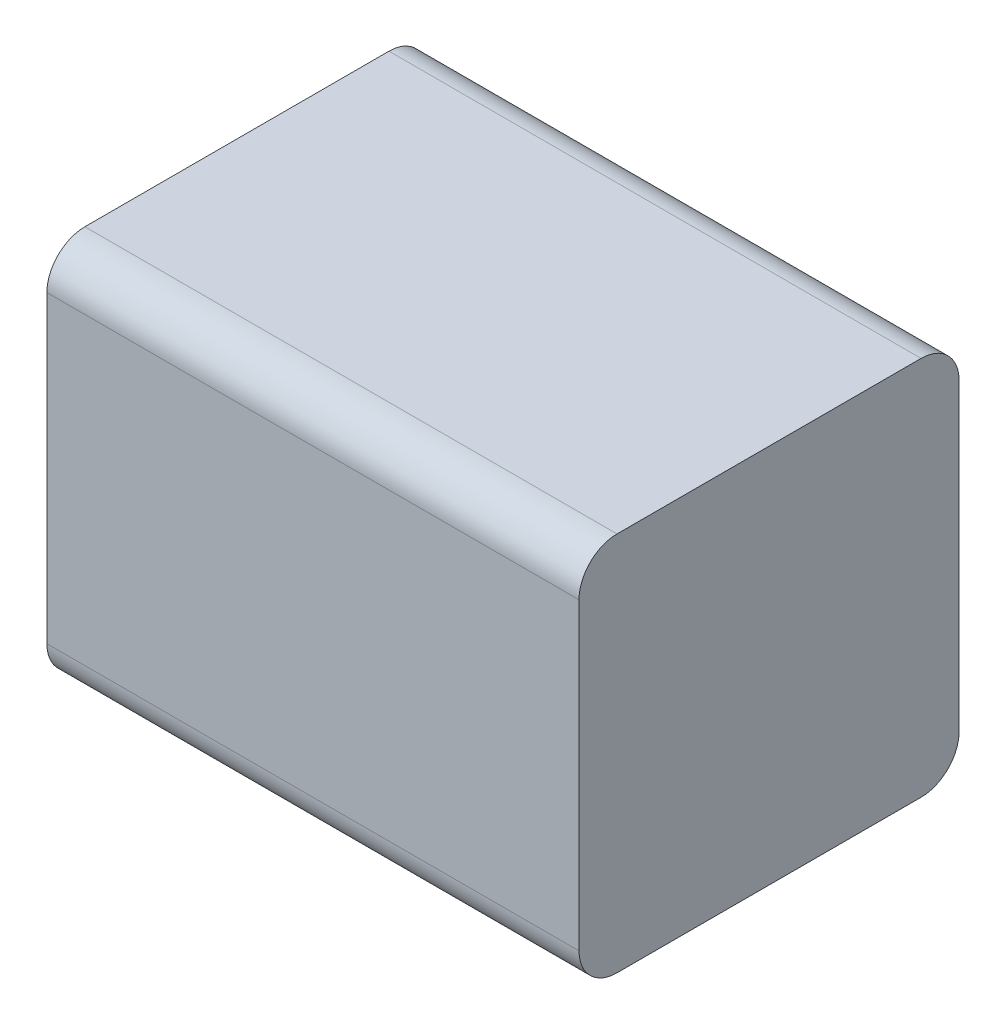
ISO-10303-21;
HEADER;
FILE_DESCRIPTION(('STEP AP214'),'2;1');
FILE_NAME('part.step','',(''),(''),'','','');
FILE_SCHEMA(('AUTOMOTIVE_DESIGN { 1 0 10303 214 1 1 1 1 }'));
ENDSEC;
DATA;
#1=APPLICATION_CONTEXT('core data for automotive mechanical design processes');
#2=APPLICATION_PROTOCOL_DEFINITION('international standard','automotive_design',2000,#1);
#3=PRODUCT_CONTEXT('',#1,'mechanical');
#4=PRODUCT('Part','Part','',(#3));
#5=PRODUCT_RELATED_PRODUCT_CATEGORY('part','',(#4));
#6=PRODUCT_DEFINITION_FORMATION('','',#4);
#7=PRODUCT_DEFINITION_CONTEXT('part definition',#1,'design');
#8=PRODUCT_DEFINITION('design','',#6,#7);
#9=PRODUCT_DEFINITION_SHAPE('','',#8);
#10=(LENGTH_UNIT() NAMED_UNIT(*) SI_UNIT(.MILLI.,.METRE.));
#11=(NAMED_UNIT(*) PLANE_ANGLE_UNIT() SI_UNIT($,.RADIAN.));
#12=(NAMED_UNIT(*) SI_UNIT($,.STERADIAN.) SOLID_ANGLE_UNIT());
#13=UNCERTAINTY_MEASURE_WITH_UNIT(LENGTH_MEASURE(1.E-05),#10,'distance_accuracy_value','');
#14=(GEOMETRIC_REPRESENTATION_CONTEXT(3) GLOBAL_UNCERTAINTY_ASSIGNED_CONTEXT((#13)) GLOBAL_UNIT_ASSIGNED_CONTEXT((#10,
#11,#12)) REPRESENTATION_CONTEXT('',''));
#15=CARTESIAN_POINT('',(0.,0.,0.));
#16=DIRECTION('',(0.,0.,1.));
#17=DIRECTION('',(1.,0.,0.));
#18=AXIS2_PLACEMENT_3D('',#15,#16,#17);
#19=CARTESIAN_POINT('',(34.756027888937,18.395082989218,0.05));
#20=DIRECTION('',(0.999999999999985,1.74845553146897E-07,0.));
#21=DIRECTION('',(-1.74845553146897E-07,0.999999999999985,0.));
#22=AXIS2_PLACEMENT_3D('',#19,#20,#21);
#23=CYLINDRICAL_SURFACE('',#22,0.05);
#24=DIRECTION('',(0.999999999999985,1.74845553146897E-07,0.));
#25=VECTOR('',#24,1.);
#26=CARTESIAN_POINT('',(34.756027880195,18.445082989218,0.05));
#27=LINE('',#26,#25);
#28=CARTESIAN_POINT('',(34.906027880195,18.445083015445,0.05));
#29=VERTEX_POINT('',#28);
#30=CARTESIAN_POINT('',(35.606027880195,18.445083137837,0.05));
#31=VERTEX_POINT('',#30);
#32=EDGE_CURVE('E11',#29,#31,#27,.T.);
#33=ORIENTED_EDGE('',*,*,#32,.T.);
#34=CARTESIAN_POINT('',(35.606027888937,18.395083137837,0.05));
#35=DIRECTION('',(0.999999999999985,1.74845553146897E-07,0.));
#36=DIRECTION('',(-1.74845553146897E-07,0.999999999999985,0.));
#37=AXIS2_PLACEMENT_3D('',#34,#35,#36);
#38=CIRCLE('',#37,0.05);
#39=CARTESIAN_POINT('',(35.606027888937,18.395083137837,0.));
#40=VERTEX_POINT('',#39);
#41=EDGE_CURVE('E146',#40,#31,#38,.T.);
#42=ORIENTED_EDGE('',*,*,#41,.F.);
#43=DIRECTION('',(0.999999999999985,1.74845553146897E-07,0.));
#44=VECTOR('',#43,1.);
#45=CARTESIAN_POINT('',(34.756027888937,18.395082989218,0.));
#46=LINE('',#45,#44);
#47=CARTESIAN_POINT('',(34.906027888937,18.395083015445,0.));
#48=VERTEX_POINT('',#47);
#49=EDGE_CURVE('E41',#48,#40,#46,.T.);
#50=ORIENTED_EDGE('',*,*,#49,.F.);
#51=CARTESIAN_POINT('',(34.906027888937,18.395083015445,0.05));
#52=DIRECTION('',(0.999999999999985,1.74845553146897E-07,0.));
#53=DIRECTION('',(-1.74845553146897E-07,0.999999999999985,0.));
#54=AXIS2_PLACEMENT_3D('',#51,#52,#53);
#55=CIRCLE('',#54,0.05);
#56=EDGE_CURVE('E174',#48,#29,#55,.T.);
#57=ORIENTED_EDGE('',*,*,#56,.T.);
#58=EDGE_LOOP('',(#33,#42,#50,#57));
#59=FACE_BOUND('',#58,.T.);
#60=ADVANCED_FACE('F16',(#59),#23,.T.);
#61=CARTESIAN_POINT('',(34.756027880195,18.445082989218,0.));
#62=DIRECTION('',(-1.74845553146897E-07,0.999999999999985,0.));
#63=DIRECTION('',(0.,0.,1.));
#64=AXIS2_PLACEMENT_3D('',#61,#62,#63);
#65=PLANE('',#64);
#66=ORIENTED_EDGE('',*,*,#32,.F.);
#67=DIRECTION('',(0.,0.,1.));
#68=VECTOR('',#67,1.);
#69=CARTESIAN_POINT('',(34.906027880195,18.445083015445,0.));
#70=LINE('',#69,#68);
#71=CARTESIAN_POINT('',(34.906027880195,18.445083015445,0.45));
#72=VERTEX_POINT('',#71);
#73=EDGE_CURVE('E131',#29,#72,#70,.T.);
#74=ORIENTED_EDGE('',*,*,#73,.T.);
#75=DIRECTION('',(0.999999999999985,1.74845553146897E-07,0.));
#76=VECTOR('',#75,1.);
#77=CARTESIAN_POINT('',(34.756027880195,18.445082989218,0.45));
#78=LINE('',#77,#76);
#79=CARTESIAN_POINT('',(35.606027880195,18.445083137837,0.45));
#80=VERTEX_POINT('',#79);
#81=EDGE_CURVE('E27',#72,#80,#78,.T.);
#82=ORIENTED_EDGE('',*,*,#81,.T.);
#83=DIRECTION('',(0.,0.,1.));
#84=VECTOR('',#83,1.);
#85=CARTESIAN_POINT('',(35.606027880195,18.445083137837,0.));
#86=LINE('',#85,#84);
#87=EDGE_CURVE('E20',#31,#80,#86,.T.);
#88=ORIENTED_EDGE('',*,*,#87,.F.);
#89=EDGE_LOOP('',(#66,#74,#82,#88));
#90=FACE_BOUND('',#89,.T.);
#91=ADVANCED_FACE('F127',(#90),#65,.T.);
#92=CARTESIAN_POINT('',(34.756027888937,18.395082989218,0.45));
#93=DIRECTION('',(0.999999999999985,1.74845553146897E-07,0.));
#94=DIRECTION('',(-1.74845553146897E-07,0.999999999999985,0.));
#95=AXIS2_PLACEMENT_3D('',#92,#93,#94);
#96=CYLINDRICAL_SURFACE('',#95,0.05);
#97=ORIENTED_EDGE('',*,*,#81,.F.);
#98=CARTESIAN_POINT('',(34.906027888937,18.395083015445,0.45));
#99=DIRECTION('',(0.999999999999985,1.74845553146897E-07,0.));
#100=DIRECTION('',(-1.74845553146897E-07,0.999999999999985,0.));
#101=AXIS2_PLACEMENT_3D('',#98,#99,#100);
#102=CIRCLE('',#101,0.05);
#103=CARTESIAN_POINT('',(34.906027888937,18.395083015445,0.5));
#104=VERTEX_POINT('',#103);
#105=EDGE_CURVE('E170',#72,#104,#102,.T.);
#106=ORIENTED_EDGE('',*,*,#105,.T.);
#107=DIRECTION('',(0.999999999999985,1.74845553146897E-07,0.));
#108=VECTOR('',#107,1.);
#109=CARTESIAN_POINT('',(34.756027888937,18.395082989218,0.5));
#110=LINE('',#109,#108);
#111=CARTESIAN_POINT('',(35.606027888937,18.395083137837,0.5));
#112=VERTEX_POINT('',#111);
#113=EDGE_CURVE('E136',#104,#112,#110,.T.);
#114=ORIENTED_EDGE('',*,*,#113,.T.);
#115=CARTESIAN_POINT('',(35.606027888937,18.395083137837,0.45));
#116=DIRECTION('',(0.999999999999985,1.74845553146897E-07,0.));
#117=DIRECTION('',(-1.74845553146897E-07,0.999999999999985,0.));
#118=AXIS2_PLACEMENT_3D('',#115,#116,#117);
#119=CIRCLE('',#118,0.05);
#120=EDGE_CURVE('E139',#80,#112,#119,.T.);
#121=ORIENTED_EDGE('',*,*,#120,.F.);
#122=EDGE_LOOP('',(#97,#106,#114,#121));
#123=FACE_BOUND('',#122,.T.);
#124=ADVANCED_FACE('F140',(#123),#96,.T.);
#125=CARTESIAN_POINT('',(34.756027967618,17.945082989218,0.5));
#126=DIRECTION('',(0.,0.,1.));
#127=DIRECTION('',(1.,0.,0.));
#128=AXIS2_PLACEMENT_3D('',#125,#126,#127);
#129=PLANE('',#128);
#130=DIRECTION('',(-1.74845553146897E-07,0.999999999999985,0.));
#131=VECTOR('',#130,1.);
#132=CARTESIAN_POINT('',(34.906027967618,17.945083015445,0.5));
#133=LINE('',#132,#131);
#134=CARTESIAN_POINT('',(34.906027958875,17.995083015445,0.5));
#135=VERTEX_POINT('',#134);
#136=EDGE_CURVE('E173',#135,#104,#133,.T.);
#137=ORIENTED_EDGE('',*,*,#136,.F.);
#138=DIRECTION('',(0.999999999999985,1.74845553146897E-07,0.));
#139=VECTOR('',#138,1.);
#140=CARTESIAN_POINT('',(34.756027958875,17.995082989218,0.5));
#141=LINE('',#140,#139);
#142=CARTESIAN_POINT('',(35.606027958875,17.995083137837,0.5));
#143=VERTEX_POINT('',#142);
#144=EDGE_CURVE('E215',#135,#143,#141,.T.);
#145=ORIENTED_EDGE('',*,*,#144,.T.);
#146=DIRECTION('',(-1.74845553146897E-07,0.999999999999985,0.));
#147=VECTOR('',#146,1.);
#148=CARTESIAN_POINT('',(35.606027967618,17.945083137837,0.5));
#149=LINE('',#148,#147);
#150=EDGE_CURVE('E143',#143,#112,#149,.T.);
#151=ORIENTED_EDGE('',*,*,#150,.T.);
#152=ORIENTED_EDGE('',*,*,#113,.F.);
#153=EDGE_LOOP('',(#137,#145,#151,#152));
#154=FACE_BOUND('',#153,.T.);
#155=ADVANCED_FACE('F196',(#154),#129,.T.);
#156=CARTESIAN_POINT('',(34.756027967618,17.945082989218,0.));
#157=DIRECTION('',(0.,0.,1.));
#158=DIRECTION('',(1.,0.,0.));
#159=AXIS2_PLACEMENT_3D('',#156,#157,#158);
#160=PLANE('',#159);
#161=ORIENTED_EDGE('',*,*,#49,.T.);
#162=DIRECTION('',(-1.74845553146897E-07,0.999999999999985,0.));
#163=VECTOR('',#162,1.);
#164=CARTESIAN_POINT('',(35.606027967618,17.945083137837,0.));
#165=LINE('',#164,#163);
#166=CARTESIAN_POINT('',(35.606027958875,17.995083137837,0.));
#167=VERTEX_POINT('',#166);
#168=EDGE_CURVE('E116',#167,#40,#165,.T.);
#169=ORIENTED_EDGE('',*,*,#168,.F.);
#170=DIRECTION('',(0.999999999999985,1.74845553146897E-07,0.));
#171=VECTOR('',#170,1.);
#172=CARTESIAN_POINT('',(34.756027958875,17.995082989218,0.));
#173=LINE('',#172,#171);
#174=CARTESIAN_POINT('',(34.906027958875,17.995083015445,0.));
#175=VERTEX_POINT('',#174);
#176=EDGE_CURVE('E163',#175,#167,#173,.T.);
#177=ORIENTED_EDGE('',*,*,#176,.F.);
#178=DIRECTION('',(-1.74845553146897E-07,0.999999999999985,0.));
#179=VECTOR('',#178,1.);
#180=CARTESIAN_POINT('',(34.906027967618,17.945083015445,0.));
#181=LINE('',#180,#179);
#182=EDGE_CURVE('E108',#175,#48,#181,.T.);
#183=ORIENTED_EDGE('',*,*,#182,.T.);
#184=EDGE_LOOP('',(#161,#169,#177,#183));
#185=FACE_BOUND('',#184,.T.);
#186=ADVANCED_FACE('F18',(#185),#160,.F.);
#187=CARTESIAN_POINT('',(34.906027967618,17.945083015445,0.));
#188=DIRECTION('',(0.999999999999985,1.74845553146897E-07,0.));
#189=DIRECTION('',(0.,0.,-1.));
#190=AXIS2_PLACEMENT_3D('',#187,#188,#189);
#191=PLANE('',#190);
#192=CARTESIAN_POINT('',(34.906027958875,17.995083015445,0.45));
#193=DIRECTION('',(0.999999999999985,1.74845553146897E-07,0.));
#194=DIRECTION('',(1.74845553146897E-07,-0.999999999999985,0.));
#195=AXIS2_PLACEMENT_3D('',#192,#193,#194);
#196=CIRCLE('',#195,0.05);
#197=CARTESIAN_POINT('',(34.906027967618,17.945083015445,0.45));
#198=VERTEX_POINT('',#197);
#199=EDGE_CURVE('E217',#135,#198,#196,.T.);
#200=ORIENTED_EDGE('',*,*,#199,.F.);
#201=ORIENTED_EDGE('',*,*,#136,.T.);
#202=ORIENTED_EDGE('',*,*,#105,.F.);
#203=ORIENTED_EDGE('',*,*,#73,.F.);
#204=ORIENTED_EDGE('',*,*,#56,.F.);
#205=ORIENTED_EDGE('',*,*,#182,.F.);
#206=CARTESIAN_POINT('',(34.906027958875,17.995083015445,0.05));
#207=DIRECTION('',(0.999999999999985,1.74845553146897E-07,0.));
#208=DIRECTION('',(1.74845553146897E-07,-0.999999999999985,0.));
#209=AXIS2_PLACEMENT_3D('',#206,#207,#208);
#210=CIRCLE('',#209,0.05);
#211=CARTESIAN_POINT('',(34.906027967618,17.945083015445,0.05));
#212=VERTEX_POINT('',#211);
#213=EDGE_CURVE('E160',#212,#175,#210,.T.);
#214=ORIENTED_EDGE('',*,*,#213,.F.);
#215=DIRECTION('',(0.,0.,1.));
#216=VECTOR('',#215,1.);
#217=CARTESIAN_POINT('',(34.906027967618,17.945083015445,0.));
#218=LINE('',#217,#216);
#219=EDGE_CURVE('E221',#212,#198,#218,.T.);
#220=ORIENTED_EDGE('',*,*,#219,.T.);
#221=EDGE_LOOP('',(#200,#201,#202,#203,#204,#205,#214,#220));
#222=FACE_BOUND('',#221,.T.);
#223=ADVANCED_FACE('F183',(#222),#191,.F.);
#224=CARTESIAN_POINT('',(34.756027958875,17.995082989218,0.45));
#225=DIRECTION('',(0.999999999999985,1.74845553146897E-07,0.));
#226=DIRECTION('',(1.74845553146897E-07,-0.999999999999985,0.));
#227=AXIS2_PLACEMENT_3D('',#224,#225,#226);
#228=CYLINDRICAL_SURFACE('',#227,0.05);
#229=DIRECTION('',(0.999999999999985,1.74845553146897E-07,0.));
#230=VECTOR('',#229,1.);
#231=CARTESIAN_POINT('',(34.756027967618,17.945082989218,0.45));
#232=LINE('',#231,#230);
#233=CARTESIAN_POINT('',(35.606027967618,17.945083137837,0.45));
#234=VERTEX_POINT('',#233);
#235=EDGE_CURVE('E238',#198,#234,#232,.T.);
#236=ORIENTED_EDGE('',*,*,#235,.T.);
#237=CARTESIAN_POINT('',(35.606027958875,17.995083137837,0.45));
#238=DIRECTION('',(0.999999999999985,1.74845553146897E-07,0.));
#239=DIRECTION('',(1.74845553146897E-07,-0.999999999999985,0.));
#240=AXIS2_PLACEMENT_3D('',#237,#238,#239);
#241=CIRCLE('',#240,0.05);
#242=EDGE_CURVE('E69',#143,#234,#241,.T.);
#243=ORIENTED_EDGE('',*,*,#242,.F.);
#244=ORIENTED_EDGE('',*,*,#144,.F.);
#245=ORIENTED_EDGE('',*,*,#199,.T.);
#246=EDGE_LOOP('',(#236,#243,#244,#245));
#247=FACE_BOUND('',#246,.T.);
#248=ADVANCED_FACE('F197',(#247),#228,.T.);
#249=CARTESIAN_POINT('',(35.606027967618,17.945083137837,0.));
#250=DIRECTION('',(0.999999999999985,1.74845553146897E-07,0.));
#251=DIRECTION('',(0.,0.,-1.));
#252=AXIS2_PLACEMENT_3D('',#249,#250,#251);
#253=PLANE('',#252);
#254=DIRECTION('',(0.,0.,1.));
#255=VECTOR('',#254,1.);
#256=CARTESIAN_POINT('',(35.606027967618,17.945083137837,0.));
#257=LINE('',#256,#255);
#258=CARTESIAN_POINT('',(35.606027967618,17.945083137837,0.05));
#259=VERTEX_POINT('',#258);
#260=EDGE_CURVE('E235',#259,#234,#257,.T.);
#261=ORIENTED_EDGE('',*,*,#260,.F.);
#262=CARTESIAN_POINT('',(35.606027958875,17.995083137837,0.05));
#263=DIRECTION('',(0.999999999999985,1.74845553146897E-07,0.));
#264=DIRECTION('',(1.74845553146897E-07,-0.999999999999985,0.));
#265=AXIS2_PLACEMENT_3D('',#262,#263,#264);
#266=CIRCLE('',#265,0.05);
#267=EDGE_CURVE('E85',#259,#167,#266,.T.);
#268=ORIENTED_EDGE('',*,*,#267,.T.);
#269=ORIENTED_EDGE('',*,*,#168,.T.);
#270=ORIENTED_EDGE('',*,*,#41,.T.);
#271=ORIENTED_EDGE('',*,*,#87,.T.);
#272=ORIENTED_EDGE('',*,*,#120,.T.);
#273=ORIENTED_EDGE('',*,*,#150,.F.);
#274=ORIENTED_EDGE('',*,*,#242,.T.);
#275=EDGE_LOOP('',(#261,#268,#269,#270,#271,#272,#273,#274));
#276=FACE_BOUND('',#275,.T.);
#277=ADVANCED_FACE('F145',(#276),#253,.T.);
#278=CARTESIAN_POINT('',(34.756027958875,17.995082989218,0.05));
#279=DIRECTION('',(0.999999999999985,1.74845553146897E-07,0.));
#280=DIRECTION('',(1.74845553146897E-07,-0.999999999999985,0.));
#281=AXIS2_PLACEMENT_3D('',#278,#279,#280);
#282=CYLINDRICAL_SURFACE('',#281,0.05);
#283=DIRECTION('',(0.999999999999985,1.74845553146897E-07,0.));
#284=VECTOR('',#283,1.);
#285=CARTESIAN_POINT('',(34.756027967618,17.945082989218,0.05));
#286=LINE('',#285,#284);
#287=EDGE_CURVE('E164',#212,#259,#286,.T.);
#288=ORIENTED_EDGE('',*,*,#287,.F.);
#289=ORIENTED_EDGE('',*,*,#213,.T.);
#290=ORIENTED_EDGE('',*,*,#176,.T.);
#291=ORIENTED_EDGE('',*,*,#267,.F.);
#292=EDGE_LOOP('',(#288,#289,#290,#291));
#293=FACE_BOUND('',#292,.T.);
#294=ADVANCED_FACE('F179',(#293),#282,.T.);
#295=CARTESIAN_POINT('',(34.756027967618,17.945082989218,0.));
#296=DIRECTION('',(-1.74845553146897E-07,0.999999999999985,0.));
#297=DIRECTION('',(0.,0.,1.));
#298=AXIS2_PLACEMENT_3D('',#295,#296,#297);
#299=PLANE('',#298);
#300=ORIENTED_EDGE('',*,*,#260,.T.);
#301=ORIENTED_EDGE('',*,*,#235,.F.);
#302=ORIENTED_EDGE('',*,*,#219,.F.);
#303=ORIENTED_EDGE('',*,*,#287,.T.);
#304=EDGE_LOOP('',(#300,#301,#302,#303));
#305=FACE_BOUND('',#304,.T.);
#306=ADVANCED_FACE('F193',(#305),#299,.F.);
#307=CLOSED_SHELL('',(#60,#91,#124,#155,#186,#223,#248,#277,#294,#306));
#308=MANIFOLD_SOLID_BREP('B1',#307);
#309=ADVANCED_BREP_SHAPE_REPRESENTATION('',(#18,#308),#14);
#310=SHAPE_DEFINITION_REPRESENTATION(#9,#309);
ENDSEC;
END-ISO-10303-21;
